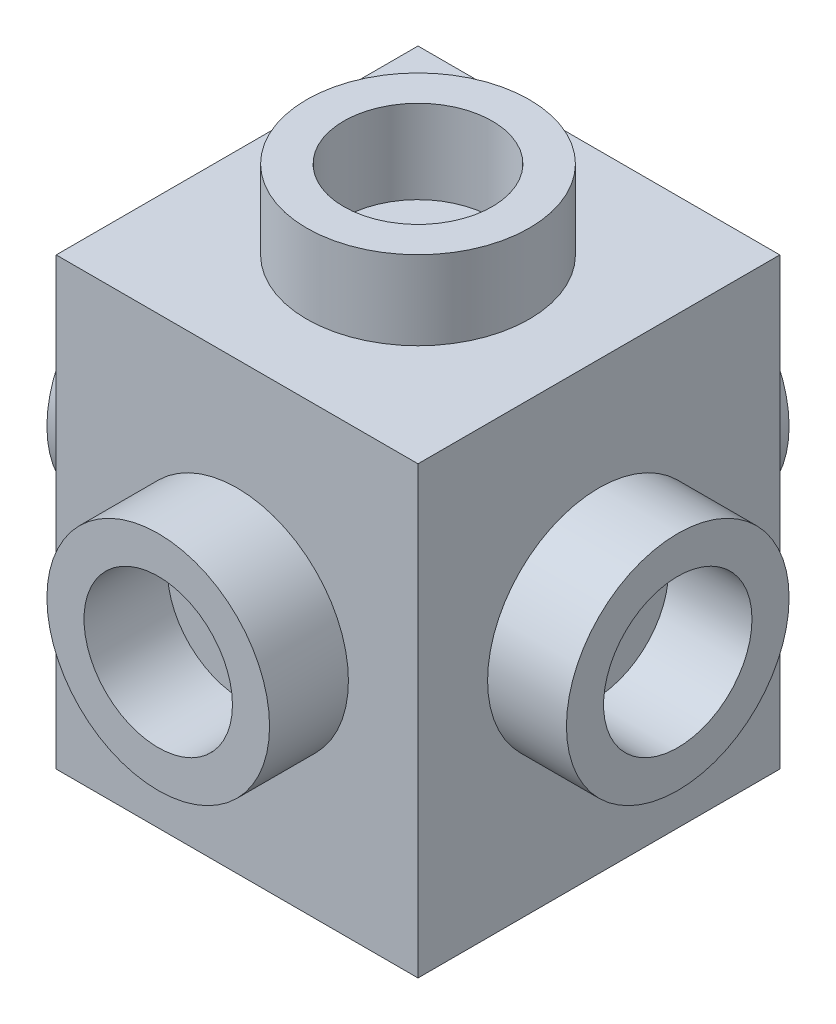
ISO-10303-21;
HEADER;
FILE_DESCRIPTION(('STEP AP214'),'2;1');
FILE_NAME('part.step','',(''),(''),'','','');
FILE_SCHEMA(('AUTOMOTIVE_DESIGN { 1 0 10303 214 1 1 1 1 }'));
ENDSEC;
DATA;
#1=APPLICATION_CONTEXT('core data for automotive mechanical design processes');
#2=APPLICATION_PROTOCOL_DEFINITION('international standard','automotive_design',2000,#1);
#3=PRODUCT_CONTEXT('',#1,'mechanical');
#4=PRODUCT('Part','Part','',(#3));
#5=PRODUCT_RELATED_PRODUCT_CATEGORY('part','',(#4));
#6=PRODUCT_DEFINITION_FORMATION('','',#4);
#7=PRODUCT_DEFINITION_CONTEXT('part definition',#1,'design');
#8=PRODUCT_DEFINITION('design','',#6,#7);
#9=PRODUCT_DEFINITION_SHAPE('','',#8);
#10=(LENGTH_UNIT() NAMED_UNIT(*) SI_UNIT(.MILLI.,.METRE.));
#11=(NAMED_UNIT(*) PLANE_ANGLE_UNIT() SI_UNIT($,.RADIAN.));
#12=(NAMED_UNIT(*) SI_UNIT($,.STERADIAN.) SOLID_ANGLE_UNIT());
#13=UNCERTAINTY_MEASURE_WITH_UNIT(LENGTH_MEASURE(1.E-05),#10,'distance_accuracy_value','');
#14=(GEOMETRIC_REPRESENTATION_CONTEXT(3) GLOBAL_UNCERTAINTY_ASSIGNED_CONTEXT((#13)) GLOBAL_UNIT_ASSIGNED_CONTEXT((#10,
#11,#12)) REPRESENTATION_CONTEXT('',''));
#15=CARTESIAN_POINT('',(0.,0.,0.));
#16=DIRECTION('',(0.,0.,1.));
#17=DIRECTION('',(1.,0.,0.));
#18=AXIS2_PLACEMENT_3D('',#15,#16,#17);
#19=CARTESIAN_POINT('',(-3.9,9.6,3.9));
#20=DIRECTION('',(1.,0.,0.));
#21=DIRECTION('',(0.,0.,-1.));
#22=AXIS2_PLACEMENT_3D('',#19,#20,#21);
#23=PLANE('',#22);
#24=CARTESIAN_POINT('',(-3.9,4.8,0.));
#25=DIRECTION('',(-1.,0.,0.));
#26=DIRECTION('',(0.,0.,1.));
#27=AXIS2_PLACEMENT_3D('',#24,#25,#26);
#28=CIRCLE('',#27,2.4);
#29=CARTESIAN_POINT('',(-3.9,4.8,2.4));
#30=VERTEX_POINT('',#29);
#31=EDGE_CURVE('E11',#30,#30,#28,.T.);
#32=ORIENTED_EDGE('',*,*,#31,.F.);
#33=EDGE_LOOP('',(#32));
#34=FACE_BOUND('',#33,.T.);
#35=DIRECTION('',(0.,0.,1.));
#36=VECTOR('',#35,1.);
#37=CARTESIAN_POINT('',(-3.9,0.,3.9));
#38=LINE('',#37,#36);
#39=CARTESIAN_POINT('',(-3.9,0.,-3.9));
#40=VERTEX_POINT('',#39);
#41=CARTESIAN_POINT('',(-3.9,0.,3.9));
#42=VERTEX_POINT('',#41);
#43=EDGE_CURVE('E102',#40,#42,#38,.T.);
#44=ORIENTED_EDGE('',*,*,#43,.T.);
#45=DIRECTION('',(0.,-1.,0.));
#46=VECTOR('',#45,1.);
#47=CARTESIAN_POINT('',(-3.9,9.6,3.9));
#48=LINE('',#47,#46);
#49=CARTESIAN_POINT('',(-3.9,9.6,3.9));
#50=VERTEX_POINT('',#49);
#51=EDGE_CURVE('E38',#50,#42,#48,.T.);
#52=ORIENTED_EDGE('',*,*,#51,.F.);
#53=DIRECTION('',(0.,0.,1.));
#54=VECTOR('',#53,1.);
#55=CARTESIAN_POINT('',(-3.9,9.6,3.9));
#56=LINE('',#55,#54);
#57=CARTESIAN_POINT('',(-3.9,9.6,-3.9));
#58=VERTEX_POINT('',#57);
#59=EDGE_CURVE('E89',#58,#50,#56,.T.);
#60=ORIENTED_EDGE('',*,*,#59,.F.);
#61=DIRECTION('',(0.,-1.,0.));
#62=VECTOR('',#61,1.);
#63=CARTESIAN_POINT('',(-3.9,9.6,-3.9));
#64=LINE('',#63,#62);
#65=EDGE_CURVE('E98',#58,#40,#64,.T.);
#66=ORIENTED_EDGE('',*,*,#65,.T.);
#67=EDGE_LOOP('',(#44,#52,#60,#66));
#68=FACE_BOUND('',#67,.T.);
#69=ADVANCED_FACE('F35',(#34,#68),#23,.F.);
#70=CARTESIAN_POINT('',(3.9,9.6,3.9));
#71=DIRECTION('',(0.,0.,-1.));
#72=DIRECTION('',(-1.,0.,0.));
#73=AXIS2_PLACEMENT_3D('',#70,#71,#72);
#74=PLANE('',#73);
#75=CARTESIAN_POINT('',(0.,4.8,3.9));
#76=DIRECTION('',(0.,0.,1.));
#77=DIRECTION('',(1.,0.,0.));
#78=AXIS2_PLACEMENT_3D('',#75,#76,#77);
#79=CIRCLE('',#78,2.4);
#80=CARTESIAN_POINT('',(2.4,4.8,3.9));
#81=VERTEX_POINT('',#80);
#82=EDGE_CURVE('E119',#81,#81,#79,.T.);
#83=ORIENTED_EDGE('',*,*,#82,.F.);
#84=EDGE_LOOP('',(#83));
#85=FACE_BOUND('',#84,.T.);
#86=DIRECTION('',(1.,0.,0.));
#87=VECTOR('',#86,1.);
#88=CARTESIAN_POINT('',(3.9,0.,3.9));
#89=LINE('',#88,#87);
#90=CARTESIAN_POINT('',(3.9,0.,3.9));
#91=VERTEX_POINT('',#90);
#92=EDGE_CURVE('E94',#42,#91,#89,.T.);
#93=ORIENTED_EDGE('',*,*,#92,.T.);
#94=DIRECTION('',(0.,-1.,0.));
#95=VECTOR('',#94,1.);
#96=CARTESIAN_POINT('',(3.9,9.6,3.9));
#97=LINE('',#96,#95);
#98=CARTESIAN_POINT('',(3.9,9.6,3.9));
#99=VERTEX_POINT('',#98);
#100=EDGE_CURVE('E92',#99,#91,#97,.T.);
#101=ORIENTED_EDGE('',*,*,#100,.F.);
#102=DIRECTION('',(1.,0.,0.));
#103=VECTOR('',#102,1.);
#104=CARTESIAN_POINT('',(3.9,9.6,3.9));
#105=LINE('',#104,#103);
#106=EDGE_CURVE('E84',#50,#99,#105,.T.);
#107=ORIENTED_EDGE('',*,*,#106,.F.);
#108=ORIENTED_EDGE('',*,*,#51,.T.);
#109=EDGE_LOOP('',(#93,#101,#107,#108));
#110=FACE_BOUND('',#109,.T.);
#111=ADVANCED_FACE('F93',(#85,#110),#74,.F.);
#112=CARTESIAN_POINT('',(3.9,9.6,3.9));
#113=DIRECTION('',(-1.,0.,0.));
#114=DIRECTION('',(0.,0.,1.));
#115=AXIS2_PLACEMENT_3D('',#112,#113,#114);
#116=PLANE('',#115);
#117=CARTESIAN_POINT('',(3.9,4.8,0.));
#118=DIRECTION('',(1.,0.,0.));
#119=DIRECTION('',(0.,0.,-1.));
#120=AXIS2_PLACEMENT_3D('',#117,#118,#119);
#121=CIRCLE('',#120,2.4);
#122=CARTESIAN_POINT('',(3.9,4.8,-2.4));
#123=VERTEX_POINT('',#122);
#124=EDGE_CURVE('E125',#123,#123,#121,.T.);
#125=ORIENTED_EDGE('',*,*,#124,.F.);
#126=EDGE_LOOP('',(#125));
#127=FACE_BOUND('',#126,.T.);
#128=DIRECTION('',(0.,0.,-1.));
#129=VECTOR('',#128,1.);
#130=CARTESIAN_POINT('',(3.9,0.,3.9));
#131=LINE('',#130,#129);
#132=CARTESIAN_POINT('',(3.9,0.,-3.9));
#133=VERTEX_POINT('',#132);
#134=EDGE_CURVE('E70',#91,#133,#131,.T.);
#135=ORIENTED_EDGE('',*,*,#134,.T.);
#136=DIRECTION('',(0.,-1.,0.));
#137=VECTOR('',#136,1.);
#138=CARTESIAN_POINT('',(3.9,9.6,-3.9));
#139=LINE('',#138,#137);
#140=CARTESIAN_POINT('',(3.9,9.6,-3.9));
#141=VERTEX_POINT('',#140);
#142=EDGE_CURVE('E95',#141,#133,#139,.T.);
#143=ORIENTED_EDGE('',*,*,#142,.F.);
#144=DIRECTION('',(0.,0.,-1.));
#145=VECTOR('',#144,1.);
#146=CARTESIAN_POINT('',(3.9,9.6,3.9));
#147=LINE('',#146,#145);
#148=EDGE_CURVE('E87',#99,#141,#147,.T.);
#149=ORIENTED_EDGE('',*,*,#148,.F.);
#150=ORIENTED_EDGE('',*,*,#100,.T.);
#151=EDGE_LOOP('',(#135,#143,#149,#150));
#152=FACE_BOUND('',#151,.T.);
#153=ADVANCED_FACE('F96',(#127,#152),#116,.F.);
#154=CARTESIAN_POINT('',(3.9,9.6,-3.9));
#155=DIRECTION('',(0.,0.,1.));
#156=DIRECTION('',(1.,0.,0.));
#157=AXIS2_PLACEMENT_3D('',#154,#155,#156);
#158=PLANE('',#157);
#159=CARTESIAN_POINT('',(0.,4.8,-3.9));
#160=DIRECTION('',(0.,0.,-1.));
#161=DIRECTION('',(-1.,0.,0.));
#162=AXIS2_PLACEMENT_3D('',#159,#160,#161);
#163=CIRCLE('',#162,2.4);
#164=CARTESIAN_POINT('',(-2.4,4.8,-3.9));
#165=VERTEX_POINT('',#164);
#166=EDGE_CURVE('E44',#165,#165,#163,.T.);
#167=ORIENTED_EDGE('',*,*,#166,.F.);
#168=EDGE_LOOP('',(#167));
#169=FACE_BOUND('',#168,.T.);
#170=DIRECTION('',(-1.,0.,0.));
#171=VECTOR('',#170,1.);
#172=CARTESIAN_POINT('',(3.9,0.,-3.9));
#173=LINE('',#172,#171);
#174=EDGE_CURVE('E76',#133,#40,#173,.T.);
#175=ORIENTED_EDGE('',*,*,#174,.T.);
#176=ORIENTED_EDGE('',*,*,#65,.F.);
#177=DIRECTION('',(-1.,0.,0.));
#178=VECTOR('',#177,1.);
#179=CARTESIAN_POINT('',(3.9,9.6,-3.9));
#180=LINE('',#179,#178);
#181=EDGE_CURVE('E53',#141,#58,#180,.T.);
#182=ORIENTED_EDGE('',*,*,#181,.F.);
#183=ORIENTED_EDGE('',*,*,#142,.T.);
#184=EDGE_LOOP('',(#175,#176,#182,#183));
#185=FACE_BOUND('',#184,.T.);
#186=ADVANCED_FACE('F110',(#169,#185),#158,.F.);
#187=CARTESIAN_POINT('',(0.,9.6,0.));
#188=DIRECTION('',(0.,1.,0.));
#189=DIRECTION('',(0.,0.,1.));
#190=AXIS2_PLACEMENT_3D('',#187,#188,#189);
#191=PLANE('',#190);
#192=CARTESIAN_POINT('',(0.,9.6,0.));
#193=DIRECTION('',(0.,1.,0.));
#194=DIRECTION('',(0.,0.,1.));
#195=AXIS2_PLACEMENT_3D('',#192,#193,#194);
#196=CIRCLE('',#195,2.4);
#197=CARTESIAN_POINT('',(0.,9.6,2.4));
#198=VERTEX_POINT('',#197);
#199=EDGE_CURVE('E116',#198,#198,#196,.T.);
#200=ORIENTED_EDGE('',*,*,#199,.F.);
#201=EDGE_LOOP('',(#200));
#202=FACE_BOUND('',#201,.T.);
#203=ORIENTED_EDGE('',*,*,#59,.T.);
#204=ORIENTED_EDGE('',*,*,#106,.T.);
#205=ORIENTED_EDGE('',*,*,#148,.T.);
#206=ORIENTED_EDGE('',*,*,#181,.T.);
#207=EDGE_LOOP('',(#203,#204,#205,#206));
#208=FACE_BOUND('',#207,.T.);
#209=ADVANCED_FACE('F85',(#202,#208),#191,.T.);
#210=CARTESIAN_POINT('',(0.,0.,0.));
#211=DIRECTION('',(0.,1.,0.));
#212=DIRECTION('',(0.,0.,1.));
#213=AXIS2_PLACEMENT_3D('',#210,#211,#212);
#214=PLANE('',#213);
#215=CARTESIAN_POINT('',(0.,0.,0.));
#216=DIRECTION('',(0.,-1.,0.));
#217=DIRECTION('',(0.,0.,-1.));
#218=AXIS2_PLACEMENT_3D('',#215,#216,#217);
#219=CIRCLE('',#218,2.5);
#220=CARTESIAN_POINT('',(0.,0.,-2.5));
#221=VERTEX_POINT('',#220);
#222=EDGE_CURVE('E142',#221,#221,#219,.T.);
#223=ORIENTED_EDGE('',*,*,#222,.F.);
#224=EDGE_LOOP('',(#223));
#225=FACE_BOUND('',#224,.T.);
#226=ORIENTED_EDGE('',*,*,#43,.F.);
#227=ORIENTED_EDGE('',*,*,#174,.F.);
#228=ORIENTED_EDGE('',*,*,#134,.F.);
#229=ORIENTED_EDGE('',*,*,#92,.F.);
#230=EDGE_LOOP('',(#226,#227,#228,#229));
#231=FACE_BOUND('',#230,.T.);
#232=ADVANCED_FACE('F113',(#225,#231),#214,.F.);
#233=CARTESIAN_POINT('',(0.,11.3,0.));
#234=DIRECTION('',(0.,-1.,0.));
#235=DIRECTION('',(0.,0.,-1.));
#236=AXIS2_PLACEMENT_3D('',#233,#234,#235);
#237=CYLINDRICAL_SURFACE('',#236,2.4);
#238=CARTESIAN_POINT('',(0.,11.3,0.));
#239=DIRECTION('',(0.,1.,0.));
#240=DIRECTION('',(0.,0.,1.));
#241=AXIS2_PLACEMENT_3D('',#238,#239,#240);
#242=CIRCLE('',#241,2.4);
#243=CARTESIAN_POINT('',(0.,11.3,2.4));
#244=VERTEX_POINT('',#243);
#245=EDGE_CURVE('E105',#244,#244,#242,.T.);
#246=ORIENTED_EDGE('',*,*,#245,.F.);
#247=EDGE_LOOP('',(#246));
#248=FACE_BOUND('',#247,.T.);
#249=ORIENTED_EDGE('',*,*,#199,.T.);
#250=EDGE_LOOP('',(#249));
#251=FACE_BOUND('',#250,.T.);
#252=ADVANCED_FACE('F191',(#248,#251),#237,.T.);
#253=CARTESIAN_POINT('',(0.,11.3,0.));
#254=DIRECTION('',(0.,1.,0.));
#255=DIRECTION('',(0.,0.,1.));
#256=AXIS2_PLACEMENT_3D('',#253,#254,#255);
#257=PLANE('',#256);
#258=CARTESIAN_POINT('',(0.,11.3,0.));
#259=DIRECTION('',(0.,1.,0.));
#260=DIRECTION('',(0.,0.,1.));
#261=AXIS2_PLACEMENT_3D('',#258,#259,#260);
#262=CIRCLE('',#261,1.6);
#263=CARTESIAN_POINT('',(0.,11.3,1.6));
#264=VERTEX_POINT('',#263);
#265=EDGE_CURVE('E172',#264,#264,#262,.T.);
#266=ORIENTED_EDGE('',*,*,#265,.F.);
#267=EDGE_LOOP('',(#266));
#268=FACE_BOUND('',#267,.T.);
#269=ORIENTED_EDGE('',*,*,#245,.T.);
#270=EDGE_LOOP('',(#269));
#271=FACE_BOUND('',#270,.T.);
#272=ADVANCED_FACE('F187',(#268,#271),#257,.T.);
#273=CARTESIAN_POINT('',(0.,4.8,5.6));
#274=DIRECTION('',(0.,0.,-1.));
#275=DIRECTION('',(-1.,0.,0.));
#276=AXIS2_PLACEMENT_3D('',#273,#274,#275);
#277=CYLINDRICAL_SURFACE('',#276,2.4);
#278=CARTESIAN_POINT('',(0.,4.8,5.6));
#279=DIRECTION('',(0.,0.,1.));
#280=DIRECTION('',(1.,0.,0.));
#281=AXIS2_PLACEMENT_3D('',#278,#279,#280);
#282=CIRCLE('',#281,2.4);
#283=CARTESIAN_POINT('',(2.4,4.8,5.6));
#284=VERTEX_POINT('',#283);
#285=EDGE_CURVE('E122',#284,#284,#282,.T.);
#286=ORIENTED_EDGE('',*,*,#285,.F.);
#287=EDGE_LOOP('',(#286));
#288=FACE_BOUND('',#287,.T.);
#289=ORIENTED_EDGE('',*,*,#82,.T.);
#290=EDGE_LOOP('',(#289));
#291=FACE_BOUND('',#290,.T.);
#292=ADVANCED_FACE('F190',(#288,#291),#277,.T.);
#293=CARTESIAN_POINT('',(0.,0.,5.6));
#294=DIRECTION('',(0.,0.,1.));
#295=DIRECTION('',(1.,0.,0.));
#296=AXIS2_PLACEMENT_3D('',#293,#294,#295);
#297=PLANE('',#296);
#298=CARTESIAN_POINT('',(0.,4.8,5.6));
#299=DIRECTION('',(0.,0.,1.));
#300=DIRECTION('',(1.,0.,0.));
#301=AXIS2_PLACEMENT_3D('',#298,#299,#300);
#302=CIRCLE('',#301,1.6);
#303=CARTESIAN_POINT('',(1.6,4.8,5.6));
#304=VERTEX_POINT('',#303);
#305=EDGE_CURVE('E148',#304,#304,#302,.T.);
#306=ORIENTED_EDGE('',*,*,#305,.F.);
#307=EDGE_LOOP('',(#306));
#308=FACE_BOUND('',#307,.T.);
#309=ORIENTED_EDGE('',*,*,#285,.T.);
#310=EDGE_LOOP('',(#309));
#311=FACE_BOUND('',#310,.T.);
#312=ADVANCED_FACE('F247',(#308,#311),#297,.T.);
#313=CARTESIAN_POINT('',(5.6,4.8,0.));
#314=DIRECTION('',(-1.,0.,0.));
#315=DIRECTION('',(0.,0.,1.));
#316=AXIS2_PLACEMENT_3D('',#313,#314,#315);
#317=CYLINDRICAL_SURFACE('',#316,2.4);
#318=CARTESIAN_POINT('',(5.6,4.8,0.));
#319=DIRECTION('',(1.,0.,0.));
#320=DIRECTION('',(0.,0.,-1.));
#321=AXIS2_PLACEMENT_3D('',#318,#319,#320);
#322=CIRCLE('',#321,2.4);
#323=CARTESIAN_POINT('',(5.6,4.8,-2.4));
#324=VERTEX_POINT('',#323);
#325=EDGE_CURVE('E128',#324,#324,#322,.T.);
#326=ORIENTED_EDGE('',*,*,#325,.F.);
#327=EDGE_LOOP('',(#326));
#328=FACE_BOUND('',#327,.T.);
#329=ORIENTED_EDGE('',*,*,#124,.T.);
#330=EDGE_LOOP('',(#329));
#331=FACE_BOUND('',#330,.T.);
#332=ADVANCED_FACE('F243',(#328,#331),#317,.T.);
#333=CARTESIAN_POINT('',(5.6,0.,0.));
#334=DIRECTION('',(1.,0.,0.));
#335=DIRECTION('',(0.,0.,-1.));
#336=AXIS2_PLACEMENT_3D('',#333,#334,#335);
#337=PLANE('',#336);
#338=CARTESIAN_POINT('',(5.6,4.8,0.));
#339=DIRECTION('',(1.,0.,0.));
#340=DIRECTION('',(0.,0.,-1.));
#341=AXIS2_PLACEMENT_3D('',#338,#339,#340);
#342=CIRCLE('',#341,1.6);
#343=CARTESIAN_POINT('',(5.6,4.8,-1.6));
#344=VERTEX_POINT('',#343);
#345=EDGE_CURVE('E166',#344,#344,#342,.T.);
#346=ORIENTED_EDGE('',*,*,#345,.F.);
#347=EDGE_LOOP('',(#346));
#348=FACE_BOUND('',#347,.T.);
#349=ORIENTED_EDGE('',*,*,#325,.T.);
#350=EDGE_LOOP('',(#349));
#351=FACE_BOUND('',#350,.T.);
#352=ADVANCED_FACE('F239',(#348,#351),#337,.T.);
#353=CARTESIAN_POINT('',(0.,4.8,-5.6));
#354=DIRECTION('',(0.,0.,1.));
#355=DIRECTION('',(1.,0.,0.));
#356=AXIS2_PLACEMENT_3D('',#353,#354,#355);
#357=CYLINDRICAL_SURFACE('',#356,2.4);
#358=CARTESIAN_POINT('',(0.,4.8,-5.6));
#359=DIRECTION('',(0.,0.,-1.));
#360=DIRECTION('',(-1.,0.,0.));
#361=AXIS2_PLACEMENT_3D('',#358,#359,#360);
#362=CIRCLE('',#361,2.4);
#363=CARTESIAN_POINT('',(-2.4,4.8,-5.6));
#364=VERTEX_POINT('',#363);
#365=EDGE_CURVE('E133',#364,#364,#362,.T.);
#366=ORIENTED_EDGE('',*,*,#365,.F.);
#367=EDGE_LOOP('',(#366));
#368=FACE_BOUND('',#367,.T.);
#369=ORIENTED_EDGE('',*,*,#166,.T.);
#370=EDGE_LOOP('',(#369));
#371=FACE_BOUND('',#370,.T.);
#372=ADVANCED_FACE('F231',(#368,#371),#357,.T.);
#373=CARTESIAN_POINT('',(0.,0.,-5.6));
#374=DIRECTION('',(0.,0.,-1.));
#375=DIRECTION('',(-1.,0.,0.));
#376=AXIS2_PLACEMENT_3D('',#373,#374,#375);
#377=PLANE('',#376);
#378=CARTESIAN_POINT('',(0.,4.8,-5.6));
#379=DIRECTION('',(0.,0.,-1.));
#380=DIRECTION('',(-1.,0.,0.));
#381=AXIS2_PLACEMENT_3D('',#378,#379,#380);
#382=CIRCLE('',#381,1.6);
#383=CARTESIAN_POINT('',(-1.6,4.8,-5.6));
#384=VERTEX_POINT('',#383);
#385=EDGE_CURVE('E160',#384,#384,#382,.T.);
#386=ORIENTED_EDGE('',*,*,#385,.F.);
#387=EDGE_LOOP('',(#386));
#388=FACE_BOUND('',#387,.T.);
#389=ORIENTED_EDGE('',*,*,#365,.T.);
#390=EDGE_LOOP('',(#389));
#391=FACE_BOUND('',#390,.T.);
#392=ADVANCED_FACE('F221',(#388,#391),#377,.T.);
#393=CARTESIAN_POINT('',(-5.6,4.8,0.));
#394=DIRECTION('',(1.,0.,0.));
#395=DIRECTION('',(0.,0.,-1.));
#396=AXIS2_PLACEMENT_3D('',#393,#394,#395);
#397=CYLINDRICAL_SURFACE('',#396,2.4);
#398=CARTESIAN_POINT('',(-5.6,4.8,0.));
#399=DIRECTION('',(-1.,0.,0.));
#400=DIRECTION('',(0.,0.,1.));
#401=AXIS2_PLACEMENT_3D('',#398,#399,#400);
#402=CIRCLE('',#401,2.4);
#403=CARTESIAN_POINT('',(-5.6,4.8,2.4));
#404=VERTEX_POINT('',#403);
#405=EDGE_CURVE('E137',#404,#404,#402,.T.);
#406=ORIENTED_EDGE('',*,*,#405,.F.);
#407=EDGE_LOOP('',(#406));
#408=FACE_BOUND('',#407,.T.);
#409=ORIENTED_EDGE('',*,*,#31,.T.);
#410=EDGE_LOOP('',(#409));
#411=FACE_BOUND('',#410,.T.);
#412=ADVANCED_FACE('F218',(#408,#411),#397,.T.);
#413=CARTESIAN_POINT('',(-5.6,0.,0.));
#414=DIRECTION('',(-1.,0.,0.));
#415=DIRECTION('',(0.,0.,1.));
#416=AXIS2_PLACEMENT_3D('',#413,#414,#415);
#417=PLANE('',#416);
#418=CARTESIAN_POINT('',(-5.6,4.8,0.));
#419=DIRECTION('',(-1.,0.,0.));
#420=DIRECTION('',(0.,0.,1.));
#421=AXIS2_PLACEMENT_3D('',#418,#419,#420);
#422=CIRCLE('',#421,1.6);
#423=CARTESIAN_POINT('',(-5.6,4.8,1.6));
#424=VERTEX_POINT('',#423);
#425=EDGE_CURVE('E154',#424,#424,#422,.T.);
#426=ORIENTED_EDGE('',*,*,#425,.F.);
#427=EDGE_LOOP('',(#426));
#428=FACE_BOUND('',#427,.T.);
#429=ORIENTED_EDGE('',*,*,#405,.T.);
#430=EDGE_LOOP('',(#429));
#431=FACE_BOUND('',#430,.T.);
#432=ADVANCED_FACE('F220',(#428,#431),#417,.T.);
#433=CARTESIAN_POINT('',(0.,1.8,0.));
#434=DIRECTION('',(0.,-1.,0.));
#435=DIRECTION('',(0.,0.,-1.));
#436=AXIS2_PLACEMENT_3D('',#433,#434,#435);
#437=CYLINDRICAL_SURFACE('',#436,2.5);
#438=CARTESIAN_POINT('',(0.,1.8,0.));
#439=DIRECTION('',(0.,-1.,0.));
#440=DIRECTION('',(0.,0.,-1.));
#441=AXIS2_PLACEMENT_3D('',#438,#439,#440);
#442=CIRCLE('',#441,2.5);
#443=CARTESIAN_POINT('',(0.,1.8,-2.5));
#444=VERTEX_POINT('',#443);
#445=EDGE_CURVE('E141',#444,#444,#442,.T.);
#446=ORIENTED_EDGE('',*,*,#445,.F.);
#447=EDGE_LOOP('',(#446));
#448=FACE_BOUND('',#447,.T.);
#449=ORIENTED_EDGE('',*,*,#222,.T.);
#450=EDGE_LOOP('',(#449));
#451=FACE_BOUND('',#450,.T.);
#452=ADVANCED_FACE('F228',(#448,#451),#437,.F.);
#453=CARTESIAN_POINT('',(0.,1.8,0.));
#454=DIRECTION('',(0.,-1.,0.));
#455=DIRECTION('',(0.,0.,-1.));
#456=AXIS2_PLACEMENT_3D('',#453,#454,#455);
#457=PLANE('',#456);
#458=ORIENTED_EDGE('',*,*,#445,.T.);
#459=EDGE_LOOP('',(#458));
#460=FACE_BOUND('',#459,.T.);
#461=ADVANCED_FACE('F366',(#460),#457,.T.);
#462=CARTESIAN_POINT('',(0.,4.8,3.8));
#463=DIRECTION('',(0.,0.,1.));
#464=DIRECTION('',(1.,0.,0.));
#465=AXIS2_PLACEMENT_3D('',#462,#463,#464);
#466=CYLINDRICAL_SURFACE('',#465,1.6);
#467=CARTESIAN_POINT('',(0.,4.8,3.8));
#468=DIRECTION('',(0.,0.,1.));
#469=DIRECTION('',(1.,0.,0.));
#470=AXIS2_PLACEMENT_3D('',#467,#468,#469);
#471=CIRCLE('',#470,1.6);
#472=CARTESIAN_POINT('',(1.6,4.8,3.8));
#473=VERTEX_POINT('',#472);
#474=EDGE_CURVE('E145',#473,#473,#471,.T.);
#475=ORIENTED_EDGE('',*,*,#474,.F.);
#476=EDGE_LOOP('',(#475));
#477=FACE_BOUND('',#476,.T.);
#478=ORIENTED_EDGE('',*,*,#305,.T.);
#479=EDGE_LOOP('',(#478));
#480=FACE_BOUND('',#479,.T.);
#481=ADVANCED_FACE('F362',(#477,#480),#466,.F.);
#482=CARTESIAN_POINT('',(0.,4.8,3.8));
#483=DIRECTION('',(0.,0.,1.));
#484=DIRECTION('',(1.,0.,0.));
#485=AXIS2_PLACEMENT_3D('',#482,#483,#484);
#486=PLANE('',#485);
#487=ORIENTED_EDGE('',*,*,#474,.T.);
#488=EDGE_LOOP('',(#487));
#489=FACE_BOUND('',#488,.T.);
#490=ADVANCED_FACE('F358',(#489),#486,.T.);
#491=CARTESIAN_POINT('',(-3.8,4.8,0.));
#492=DIRECTION('',(-1.,0.,0.));
#493=DIRECTION('',(0.,0.,1.));
#494=AXIS2_PLACEMENT_3D('',#491,#492,#493);
#495=CYLINDRICAL_SURFACE('',#494,1.6);
#496=CARTESIAN_POINT('',(-3.8,4.8,0.));
#497=DIRECTION('',(-1.,0.,0.));
#498=DIRECTION('',(0.,0.,1.));
#499=AXIS2_PLACEMENT_3D('',#496,#497,#498);
#500=CIRCLE('',#499,1.6);
#501=CARTESIAN_POINT('',(-3.8,4.8,1.6));
#502=VERTEX_POINT('',#501);
#503=EDGE_CURVE('E151',#502,#502,#500,.T.);
#504=ORIENTED_EDGE('',*,*,#503,.F.);
#505=EDGE_LOOP('',(#504));
#506=FACE_BOUND('',#505,.T.);
#507=ORIENTED_EDGE('',*,*,#425,.T.);
#508=EDGE_LOOP('',(#507));
#509=FACE_BOUND('',#508,.T.);
#510=ADVANCED_FACE('F354',(#506,#509),#495,.F.);
#511=CARTESIAN_POINT('',(-3.8,4.8,0.));
#512=DIRECTION('',(-1.,0.,0.));
#513=DIRECTION('',(0.,0.,1.));
#514=AXIS2_PLACEMENT_3D('',#511,#512,#513);
#515=PLANE('',#514);
#516=ORIENTED_EDGE('',*,*,#503,.T.);
#517=EDGE_LOOP('',(#516));
#518=FACE_BOUND('',#517,.T.);
#519=ADVANCED_FACE('F297',(#518),#515,.T.);
#520=CARTESIAN_POINT('',(0.,4.8,-3.8));
#521=DIRECTION('',(0.,0.,-1.));
#522=DIRECTION('',(-1.,0.,0.));
#523=AXIS2_PLACEMENT_3D('',#520,#521,#522);
#524=CYLINDRICAL_SURFACE('',#523,1.6);
#525=CARTESIAN_POINT('',(0.,4.8,-3.8));
#526=DIRECTION('',(0.,0.,-1.));
#527=DIRECTION('',(-1.,0.,0.));
#528=AXIS2_PLACEMENT_3D('',#525,#526,#527);
#529=CIRCLE('',#528,1.6);
#530=CARTESIAN_POINT('',(-1.6,4.8,-3.8));
#531=VERTEX_POINT('',#530);
#532=EDGE_CURVE('E157',#531,#531,#529,.T.);
#533=ORIENTED_EDGE('',*,*,#532,.F.);
#534=EDGE_LOOP('',(#533));
#535=FACE_BOUND('',#534,.T.);
#536=ORIENTED_EDGE('',*,*,#385,.T.);
#537=EDGE_LOOP('',(#536));
#538=FACE_BOUND('',#537,.T.);
#539=ADVANCED_FACE('F302',(#535,#538),#524,.F.);
#540=CARTESIAN_POINT('',(0.,4.8,-3.8));
#541=DIRECTION('',(0.,0.,-1.));
#542=DIRECTION('',(-1.,0.,0.));
#543=AXIS2_PLACEMENT_3D('',#540,#541,#542);
#544=PLANE('',#543);
#545=ORIENTED_EDGE('',*,*,#532,.T.);
#546=EDGE_LOOP('',(#545));
#547=FACE_BOUND('',#546,.T.);
#548=ADVANCED_FACE('F306',(#547),#544,.T.);
#549=CARTESIAN_POINT('',(3.8,4.8,0.));
#550=DIRECTION('',(1.,0.,0.));
#551=DIRECTION('',(0.,0.,-1.));
#552=AXIS2_PLACEMENT_3D('',#549,#550,#551);
#553=CYLINDRICAL_SURFACE('',#552,1.6);
#554=CARTESIAN_POINT('',(3.8,4.8,0.));
#555=DIRECTION('',(1.,0.,0.));
#556=DIRECTION('',(0.,0.,-1.));
#557=AXIS2_PLACEMENT_3D('',#554,#555,#556);
#558=CIRCLE('',#557,1.6);
#559=CARTESIAN_POINT('',(3.8,4.8,-1.6));
#560=VERTEX_POINT('',#559);
#561=EDGE_CURVE('E163',#560,#560,#558,.T.);
#562=ORIENTED_EDGE('',*,*,#561,.F.);
#563=EDGE_LOOP('',(#562));
#564=FACE_BOUND('',#563,.T.);
#565=ORIENTED_EDGE('',*,*,#345,.T.);
#566=EDGE_LOOP('',(#565));
#567=FACE_BOUND('',#566,.T.);
#568=ADVANCED_FACE('F315',(#564,#567),#553,.F.);
#569=CARTESIAN_POINT('',(3.8,4.8,0.));
#570=DIRECTION('',(1.,0.,0.));
#571=DIRECTION('',(0.,0.,-1.));
#572=AXIS2_PLACEMENT_3D('',#569,#570,#571);
#573=PLANE('',#572);
#574=ORIENTED_EDGE('',*,*,#561,.T.);
#575=EDGE_LOOP('',(#574));
#576=FACE_BOUND('',#575,.T.);
#577=ADVANCED_FACE('F183',(#576),#573,.T.);
#578=CARTESIAN_POINT('',(0.,9.5,0.));
#579=DIRECTION('',(0.,1.,0.));
#580=DIRECTION('',(0.,0.,1.));
#581=AXIS2_PLACEMENT_3D('',#578,#579,#580);
#582=CYLINDRICAL_SURFACE('',#581,1.6);
#583=CARTESIAN_POINT('',(0.,9.5,0.));
#584=DIRECTION('',(0.,1.,0.));
#585=DIRECTION('',(0.,0.,1.));
#586=AXIS2_PLACEMENT_3D('',#583,#584,#585);
#587=CIRCLE('',#586,1.6);
#588=CARTESIAN_POINT('',(0.,9.5,1.6));
#589=VERTEX_POINT('',#588);
#590=EDGE_CURVE('E169',#589,#589,#587,.T.);
#591=ORIENTED_EDGE('',*,*,#590,.F.);
#592=EDGE_LOOP('',(#591));
#593=FACE_BOUND('',#592,.T.);
#594=ORIENTED_EDGE('',*,*,#265,.T.);
#595=EDGE_LOOP('',(#594));
#596=FACE_BOUND('',#595,.T.);
#597=ADVANCED_FACE('F180',(#593,#596),#582,.F.);
#598=CARTESIAN_POINT('',(0.,9.5,0.));
#599=DIRECTION('',(0.,1.,0.));
#600=DIRECTION('',(0.,0.,1.));
#601=AXIS2_PLACEMENT_3D('',#598,#599,#600);
#602=PLANE('',#601);
#603=ORIENTED_EDGE('',*,*,#590,.T.);
#604=EDGE_LOOP('',(#603));
#605=FACE_BOUND('',#604,.T.);
#606=ADVANCED_FACE('F178',(#605),#602,.T.);
#607=CLOSED_SHELL('',(#69,#111,#153,#186,#209,#232,#252,#272,#292,#312,#332,#352,#372,#392,#412,
#432,#452,#461,#481,#490,#510,#519,#539,#548,#568,#577,#597,#606));
#608=MANIFOLD_SOLID_BREP('B2',#607);
#609=ADVANCED_BREP_SHAPE_REPRESENTATION('',(#18,#608),#14);
#610=SHAPE_DEFINITION_REPRESENTATION(#9,#609);
ENDSEC;
END-ISO-10303-21;
